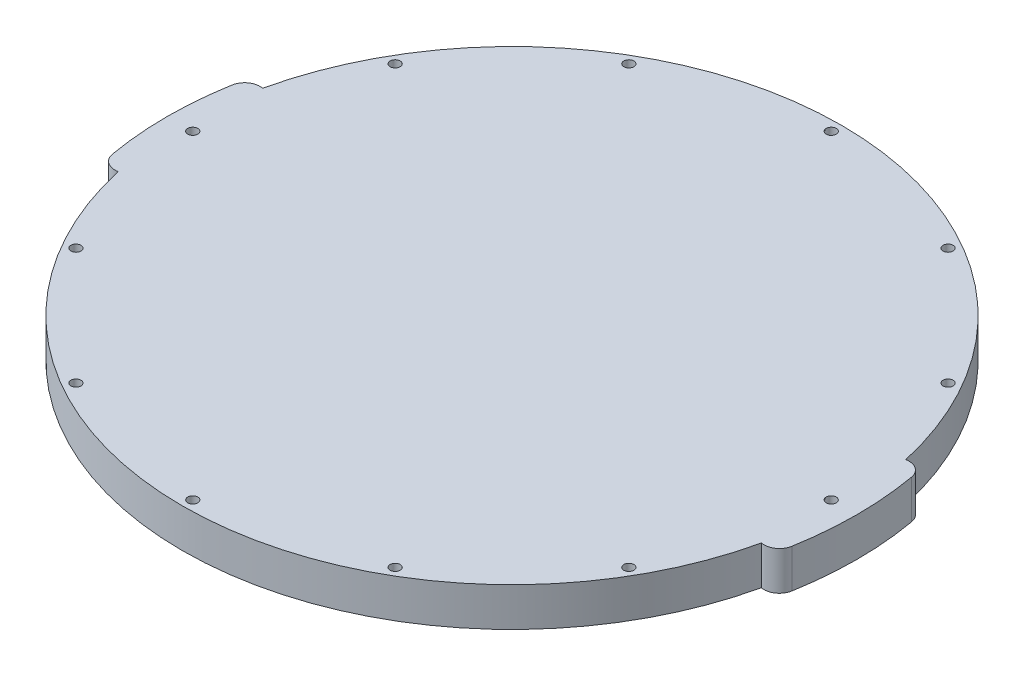
ISO-10303-21;
HEADER;
FILE_DESCRIPTION(('STEP AP214'),'2;1');
FILE_NAME('part.step','',(''),(''),'','','');
FILE_SCHEMA(('AUTOMOTIVE_DESIGN { 1 0 10303 214 1 1 1 1 }'));
ENDSEC;
DATA;
#1=APPLICATION_CONTEXT('core data for automotive mechanical design processes');
#2=APPLICATION_PROTOCOL_DEFINITION('international standard','automotive_design',2000,#1);
#3=PRODUCT_CONTEXT('',#1,'mechanical');
#4=PRODUCT('Part','Part','',(#3));
#5=PRODUCT_RELATED_PRODUCT_CATEGORY('part','',(#4));
#6=PRODUCT_DEFINITION_FORMATION('','',#4);
#7=PRODUCT_DEFINITION_CONTEXT('part definition',#1,'design');
#8=PRODUCT_DEFINITION('design','',#6,#7);
#9=PRODUCT_DEFINITION_SHAPE('','',#8);
#10=(LENGTH_UNIT() NAMED_UNIT(*) SI_UNIT(.MILLI.,.METRE.));
#11=(NAMED_UNIT(*) PLANE_ANGLE_UNIT() SI_UNIT($,.RADIAN.));
#12=(NAMED_UNIT(*) SI_UNIT($,.STERADIAN.) SOLID_ANGLE_UNIT());
#13=UNCERTAINTY_MEASURE_WITH_UNIT(LENGTH_MEASURE(1.E-05),#10,'distance_accuracy_value','');
#14=(GEOMETRIC_REPRESENTATION_CONTEXT(3) GLOBAL_UNCERTAINTY_ASSIGNED_CONTEXT((#13)) GLOBAL_UNIT_ASSIGNED_CONTEXT((#10,
#11,#12)) REPRESENTATION_CONTEXT('',''));
#15=CARTESIAN_POINT('',(0.,0.,0.));
#16=DIRECTION('',(0.,0.,1.));
#17=DIRECTION('',(1.,0.,0.));
#18=AXIS2_PLACEMENT_3D('',#15,#16,#17);
#19=CARTESIAN_POINT('',(-53.1549984688337,12.7,-9.37266038957257));
#20=DIRECTION('',(0.,-1.,0.));
#21=DIRECTION('',(0.,0.,-1.));
#22=AXIS2_PLACEMENT_3D('',#19,#20,#21);
#23=PLANE('',#22);
#24=CARTESIAN_POINT('',(-90.5429559656631,12.7,-52.2749999999999));
#25=DIRECTION('',(0.,1.,0.));
#26=DIRECTION('',(0.,0.,1.));
#27=AXIS2_PLACEMENT_3D('',#24,#25,#26);
#28=CIRCLE('',#27,1.65000000000126);
#29=CARTESIAN_POINT('',(-90.5429559656631,12.7,-50.6249999999987));
#30=VERTEX_POINT('',#29);
#31=EDGE_CURVE('E242',#30,#30,#28,.T.);
#32=ORIENTED_EDGE('',*,*,#31,.F.);
#33=EDGE_LOOP('',(#32));
#34=FACE_BOUND('',#33,.T.);
#35=CARTESIAN_POINT('',(-90.542955965663,12.7,52.2750000000001));
#36=DIRECTION('',(0.,1.,0.));
#37=DIRECTION('',(0.,0.,1.));
#38=AXIS2_PLACEMENT_3D('',#35,#36,#37);
#39=CIRCLE('',#38,1.65000000000101);
#40=CARTESIAN_POINT('',(-90.542955965663,12.7,53.9250000000011));
#41=VERTEX_POINT('',#40);
#42=EDGE_CURVE('E230',#41,#41,#39,.T.);
#43=ORIENTED_EDGE('',*,*,#42,.F.);
#44=EDGE_LOOP('',(#43));
#45=FACE_BOUND('',#44,.T.);
#46=CARTESIAN_POINT('',(0.,12.7,104.55));
#47=DIRECTION('',(0.,1.,0.));
#48=DIRECTION('',(0.,0.,1.));
#49=AXIS2_PLACEMENT_3D('',#46,#47,#48);
#50=CIRCLE('',#49,1.65000000000074);
#51=CARTESIAN_POINT('',(0.,12.7,106.200000000001));
#52=VERTEX_POINT('',#51);
#53=EDGE_CURVE('E218',#52,#52,#50,.T.);
#54=ORIENTED_EDGE('',*,*,#53,.F.);
#55=EDGE_LOOP('',(#54));
#56=FACE_BOUND('',#55,.T.);
#57=CARTESIAN_POINT('',(90.5429559656631,12.7,52.275));
#58=DIRECTION('',(0.,1.,0.));
#59=DIRECTION('',(0.,0.,1.));
#60=AXIS2_PLACEMENT_3D('',#57,#58,#59);
#61=CIRCLE('',#60,1.65000000000052);
#62=CARTESIAN_POINT('',(90.5429559656631,12.7,53.9250000000005));
#63=VERTEX_POINT('',#62);
#64=EDGE_CURVE('E206',#63,#63,#61,.T.);
#65=ORIENTED_EDGE('',*,*,#64,.F.);
#66=EDGE_LOOP('',(#65));
#67=FACE_BOUND('',#66,.T.);
#68=CARTESIAN_POINT('',(90.5429559656631,12.7,-52.275));
#69=DIRECTION('',(0.,1.,0.));
#70=DIRECTION('',(0.,0.,1.));
#71=AXIS2_PLACEMENT_3D('',#68,#69,#70);
#72=CIRCLE('',#71,1.65000000000024);
#73=CARTESIAN_POINT('',(90.5429559656631,12.7,-50.6249999999998));
#74=VERTEX_POINT('',#73);
#75=EDGE_CURVE('E194',#74,#74,#72,.T.);
#76=ORIENTED_EDGE('',*,*,#75,.F.);
#77=EDGE_LOOP('',(#76));
#78=FACE_BOUND('',#77,.T.);
#79=CARTESIAN_POINT('',(0.,12.7,-104.55));
#80=DIRECTION('',(0.,1.,0.));
#81=DIRECTION('',(0.,0.,1.));
#82=AXIS2_PLACEMENT_3D('',#79,#80,#81);
#83=CIRCLE('',#82,1.65);
#84=CARTESIAN_POINT('',(0.,12.7,-102.9));
#85=VERTEX_POINT('',#84);
#86=EDGE_CURVE('E140',#85,#85,#83,.T.);
#87=ORIENTED_EDGE('',*,*,#86,.F.);
#88=EDGE_LOOP('',(#87));
#89=FACE_BOUND('',#88,.T.);
#90=CARTESIAN_POINT('',(-106.309996937667,12.7,-18.7453207791451));
#91=DIRECTION('',(0.,1.,0.));
#92=DIRECTION('',(0.,0.,-1.));
#93=AXIS2_PLACEMENT_3D('',#90,#91,#92);
#94=CIRCLE('',#93,5.00000000000021);
#95=CARTESIAN_POINT('',(-105.327953740908,12.7,-23.6479314265143));
#96=VERTEX_POINT('',#95);
#97=CARTESIAN_POINT('',(-111.234035702729,12.7,-19.6135616674797));
#98=VERTEX_POINT('',#97);
#99=EDGE_CURVE('E151',#96,#98,#94,.T.);
#100=ORIENTED_EDGE('',*,*,#99,.T.);
#101=CARTESIAN_POINT('',(0.,12.7,0.));
#102=DIRECTION('',(0.,1.,0.));
#103=DIRECTION('',(0.,0.,-1.));
#104=AXIS2_PLACEMENT_3D('',#101,#102,#103);
#105=CIRCLE('',#104,112.95);
#106=CARTESIAN_POINT('',(-111.234035702729,12.7,19.6135616674798));
#107=VERTEX_POINT('',#106);
#108=EDGE_CURVE('E99',#98,#107,#105,.T.);
#109=ORIENTED_EDGE('',*,*,#108,.T.);
#110=CARTESIAN_POINT('',(-106.309996937668,12.7,18.7453207791452));
#111=DIRECTION('',(0.,1.,0.));
#112=DIRECTION('',(0.,0.,1.));
#113=AXIS2_PLACEMENT_3D('',#110,#111,#112);
#114=CIRCLE('',#113,5.00000000000001);
#115=CARTESIAN_POINT('',(-105.327953740908,12.7,23.6479314265144));
#116=VERTEX_POINT('',#115);
#117=EDGE_CURVE('E166',#107,#116,#114,.T.);
#118=ORIENTED_EDGE('',*,*,#117,.T.);
#119=CARTESIAN_POINT('',(0.,12.7,-4.92661467177413E-13));
#120=DIRECTION('',(0.,1.,0.));
#121=DIRECTION('',(0.,0.,-1.));
#122=AXIS2_PLACEMENT_3D('',#119,#120,#121);
#123=CIRCLE('',#122,107.95);
#124=CARTESIAN_POINT('',(105.327953740908,12.7,23.6479314265145));
#125=VERTEX_POINT('',#124);
#126=EDGE_CURVE('E179',#116,#125,#123,.T.);
#127=ORIENTED_EDGE('',*,*,#126,.T.);
#128=CARTESIAN_POINT('',(106.309996937668,12.7,18.7453207791452));
#129=DIRECTION('',(0.,1.,0.));
#130=DIRECTION('',(0.,0.,-1.));
#131=AXIS2_PLACEMENT_3D('',#128,#129,#130);
#132=CIRCLE('',#131,5.00000000000002);
#133=CARTESIAN_POINT('',(111.234035702729,12.7,19.6135616674798));
#134=VERTEX_POINT('',#133);
#135=EDGE_CURVE('E118',#125,#134,#132,.T.);
#136=ORIENTED_EDGE('',*,*,#135,.T.);
#137=CARTESIAN_POINT('',(-1.29063426612674E-12,12.7,0.));
#138=DIRECTION('',(0.,1.,0.));
#139=DIRECTION('',(0.,0.,1.));
#140=AXIS2_PLACEMENT_3D('',#137,#138,#139);
#141=CIRCLE('',#140,112.950000000001);
#142=CARTESIAN_POINT('',(111.234035702729,12.7,-19.6135616674798));
#143=VERTEX_POINT('',#142);
#144=EDGE_CURVE('E112',#134,#143,#141,.T.);
#145=ORIENTED_EDGE('',*,*,#144,.T.);
#146=CARTESIAN_POINT('',(106.309996937668,12.7,-18.7453207791452));
#147=DIRECTION('',(0.,1.,0.));
#148=DIRECTION('',(0.,0.,1.));
#149=AXIS2_PLACEMENT_3D('',#146,#147,#148);
#150=CIRCLE('',#149,5.);
#151=CARTESIAN_POINT('',(105.327953740908,12.7,-23.6479314265144));
#152=VERTEX_POINT('',#151);
#153=EDGE_CURVE('E116',#143,#152,#150,.T.);
#154=ORIENTED_EDGE('',*,*,#153,.T.);
#155=CARTESIAN_POINT('',(0.,12.7,0.));
#156=DIRECTION('',(0.,1.,0.));
#157=DIRECTION('',(0.,0.,-1.));
#158=AXIS2_PLACEMENT_3D('',#155,#156,#157);
#159=CIRCLE('',#158,107.95);
#160=EDGE_CURVE('E56',#152,#96,#159,.T.);
#161=ORIENTED_EDGE('',*,*,#160,.T.);
#162=EDGE_LOOP('',(#100,#109,#118,#127,#136,#145,#154,#161));
#163=FACE_BOUND('',#162,.T.);
#164=CARTESIAN_POINT('',(52.275,12.7,-90.5429559656631));
#165=DIRECTION('',(0.,1.,0.));
#166=DIRECTION('',(0.,0.,1.));
#167=AXIS2_PLACEMENT_3D('',#164,#165,#166);
#168=CIRCLE('',#167,1.65000000000009);
#169=CARTESIAN_POINT('',(52.275,12.7,-88.892955965663));
#170=VERTEX_POINT('',#169);
#171=EDGE_CURVE('E188',#170,#170,#168,.T.);
#172=ORIENTED_EDGE('',*,*,#171,.F.);
#173=EDGE_LOOP('',(#172));
#174=FACE_BOUND('',#173,.T.);
#175=CARTESIAN_POINT('',(104.55,12.7,0.));
#176=DIRECTION('',(0.,1.,0.));
#177=DIRECTION('',(0.,0.,1.));
#178=AXIS2_PLACEMENT_3D('',#175,#176,#177);
#179=CIRCLE('',#178,1.65000000000037);
#180=CARTESIAN_POINT('',(104.55,12.7,1.65000000000035));
#181=VERTEX_POINT('',#180);
#182=EDGE_CURVE('E200',#181,#181,#179,.T.);
#183=ORIENTED_EDGE('',*,*,#182,.F.);
#184=EDGE_LOOP('',(#183));
#185=FACE_BOUND('',#184,.T.);
#186=CARTESIAN_POINT('',(52.2750000000001,12.7,90.542955965663));
#187=DIRECTION('',(0.,1.,0.));
#188=DIRECTION('',(0.,0.,1.));
#189=AXIS2_PLACEMENT_3D('',#186,#187,#188);
#190=CIRCLE('',#189,1.65000000000066);
#191=CARTESIAN_POINT('',(52.2750000000001,12.7,92.1929559656637));
#192=VERTEX_POINT('',#191);
#193=EDGE_CURVE('E212',#192,#192,#190,.T.);
#194=ORIENTED_EDGE('',*,*,#193,.F.);
#195=EDGE_LOOP('',(#194));
#196=FACE_BOUND('',#195,.T.);
#197=CARTESIAN_POINT('',(-52.2749999999999,12.7,90.5429559656631));
#198=DIRECTION('',(0.,1.,0.));
#199=DIRECTION('',(0.,0.,1.));
#200=AXIS2_PLACEMENT_3D('',#197,#198,#199);
#201=CIRCLE('',#200,1.65000000000089);
#202=CARTESIAN_POINT('',(-52.2749999999999,12.7,92.192955965664));
#203=VERTEX_POINT('',#202);
#204=EDGE_CURVE('E224',#203,#203,#201,.T.);
#205=ORIENTED_EDGE('',*,*,#204,.F.);
#206=EDGE_LOOP('',(#205));
#207=FACE_BOUND('',#206,.T.);
#208=CARTESIAN_POINT('',(-104.55,12.7,0.));
#209=DIRECTION('',(0.,1.,0.));
#210=DIRECTION('',(0.,0.,1.));
#211=AXIS2_PLACEMENT_3D('',#208,#209,#210);
#212=CIRCLE('',#211,1.65000000000109);
#213=CARTESIAN_POINT('',(-104.55,12.7,1.65000000000112));
#214=VERTEX_POINT('',#213);
#215=EDGE_CURVE('E236',#214,#214,#212,.T.);
#216=ORIENTED_EDGE('',*,*,#215,.F.);
#217=EDGE_LOOP('',(#216));
#218=FACE_BOUND('',#217,.T.);
#219=CARTESIAN_POINT('',(-52.275,12.7,-90.542955965663));
#220=DIRECTION('',(0.,1.,0.));
#221=DIRECTION('',(0.,0.,1.));
#222=AXIS2_PLACEMENT_3D('',#219,#220,#221);
#223=CIRCLE('',#222,1.65000000000134);
#224=CARTESIAN_POINT('',(-52.275,12.7,-88.8929559656617));
#225=VERTEX_POINT('',#224);
#226=EDGE_CURVE('E248',#225,#225,#223,.T.);
#227=ORIENTED_EDGE('',*,*,#226,.F.);
#228=EDGE_LOOP('',(#227));
#229=FACE_BOUND('',#228,.T.);
#230=ADVANCED_FACE('F39',(#34,#45,#56,#67,#78,#89,#163,#174,#185,#196,#207,#218,#229),#23,.F.);
#231=CARTESIAN_POINT('',(-53.1549984688337,0.,-9.37266038957257));
#232=DIRECTION('',(0.,-1.,0.));
#233=DIRECTION('',(0.,0.,-1.));
#234=AXIS2_PLACEMENT_3D('',#231,#232,#233);
#235=PLANE('',#234);
#236=CARTESIAN_POINT('',(-90.5429559656631,0.,-52.2749999999999));
#237=DIRECTION('',(0.,1.,0.));
#238=DIRECTION('',(0.,0.,1.));
#239=AXIS2_PLACEMENT_3D('',#236,#237,#238);
#240=CIRCLE('',#239,1.65000000000126);
#241=CARTESIAN_POINT('',(-90.5429559656631,0.,-50.6249999999987));
#242=VERTEX_POINT('',#241);
#243=EDGE_CURVE('E245',#242,#242,#240,.T.);
#244=ORIENTED_EDGE('',*,*,#243,.T.);
#245=EDGE_LOOP('',(#244));
#246=FACE_BOUND('',#245,.T.);
#247=CARTESIAN_POINT('',(-90.542955965663,0.,52.2750000000001));
#248=DIRECTION('',(0.,1.,0.));
#249=DIRECTION('',(0.,0.,1.));
#250=AXIS2_PLACEMENT_3D('',#247,#248,#249);
#251=CIRCLE('',#250,1.65000000000101);
#252=CARTESIAN_POINT('',(-90.542955965663,0.,53.9250000000011));
#253=VERTEX_POINT('',#252);
#254=EDGE_CURVE('E233',#253,#253,#251,.T.);
#255=ORIENTED_EDGE('',*,*,#254,.T.);
#256=EDGE_LOOP('',(#255));
#257=FACE_BOUND('',#256,.T.);
#258=CARTESIAN_POINT('',(0.,0.,104.55));
#259=DIRECTION('',(0.,1.,0.));
#260=DIRECTION('',(0.,0.,1.));
#261=AXIS2_PLACEMENT_3D('',#258,#259,#260);
#262=CIRCLE('',#261,1.65000000000074);
#263=CARTESIAN_POINT('',(0.,0.,106.200000000001));
#264=VERTEX_POINT('',#263);
#265=EDGE_CURVE('E221',#264,#264,#262,.T.);
#266=ORIENTED_EDGE('',*,*,#265,.T.);
#267=EDGE_LOOP('',(#266));
#268=FACE_BOUND('',#267,.T.);
#269=CARTESIAN_POINT('',(90.5429559656631,0.,52.275));
#270=DIRECTION('',(0.,1.,0.));
#271=DIRECTION('',(0.,0.,1.));
#272=AXIS2_PLACEMENT_3D('',#269,#270,#271);
#273=CIRCLE('',#272,1.65000000000052);
#274=CARTESIAN_POINT('',(90.5429559656631,0.,53.9250000000005));
#275=VERTEX_POINT('',#274);
#276=EDGE_CURVE('E209',#275,#275,#273,.T.);
#277=ORIENTED_EDGE('',*,*,#276,.T.);
#278=EDGE_LOOP('',(#277));
#279=FACE_BOUND('',#278,.T.);
#280=CARTESIAN_POINT('',(90.5429559656631,0.,-52.275));
#281=DIRECTION('',(0.,1.,0.));
#282=DIRECTION('',(0.,0.,1.));
#283=AXIS2_PLACEMENT_3D('',#280,#281,#282);
#284=CIRCLE('',#283,1.65000000000024);
#285=CARTESIAN_POINT('',(90.5429559656631,0.,-50.6249999999998));
#286=VERTEX_POINT('',#285);
#287=EDGE_CURVE('E197',#286,#286,#284,.T.);
#288=ORIENTED_EDGE('',*,*,#287,.T.);
#289=EDGE_LOOP('',(#288));
#290=FACE_BOUND('',#289,.T.);
#291=CARTESIAN_POINT('',(0.,0.,-104.55));
#292=DIRECTION('',(0.,1.,0.));
#293=DIRECTION('',(0.,0.,1.));
#294=AXIS2_PLACEMENT_3D('',#291,#292,#293);
#295=CIRCLE('',#294,1.65);
#296=CARTESIAN_POINT('',(0.,0.,-102.9));
#297=VERTEX_POINT('',#296);
#298=EDGE_CURVE('E185',#297,#297,#295,.T.);
#299=ORIENTED_EDGE('',*,*,#298,.T.);
#300=EDGE_LOOP('',(#299));
#301=FACE_BOUND('',#300,.T.);
#302=CARTESIAN_POINT('',(-106.309996937667,0.,-18.7453207791451));
#303=DIRECTION('',(0.,1.,0.));
#304=DIRECTION('',(0.,0.,-1.));
#305=AXIS2_PLACEMENT_3D('',#302,#303,#304);
#306=CIRCLE('',#305,5.00000000000021);
#307=CARTESIAN_POINT('',(-105.327953740908,0.,-23.6479314265143));
#308=VERTEX_POINT('',#307);
#309=CARTESIAN_POINT('',(-111.234035702729,0.,-19.6135616674797));
#310=VERTEX_POINT('',#309);
#311=EDGE_CURVE('E136',#308,#310,#306,.T.);
#312=ORIENTED_EDGE('',*,*,#311,.F.);
#313=CARTESIAN_POINT('',(0.,0.,0.));
#314=DIRECTION('',(0.,1.,0.));
#315=DIRECTION('',(0.,0.,-1.));
#316=AXIS2_PLACEMENT_3D('',#313,#314,#315);
#317=CIRCLE('',#316,107.95);
#318=CARTESIAN_POINT('',(105.327953740908,0.,-23.6479314265144));
#319=VERTEX_POINT('',#318);
#320=EDGE_CURVE('E91',#319,#308,#317,.T.);
#321=ORIENTED_EDGE('',*,*,#320,.F.);
#322=CARTESIAN_POINT('',(106.309996937668,0.,-18.7453207791452));
#323=DIRECTION('',(0.,1.,0.));
#324=DIRECTION('',(0.,0.,1.));
#325=AXIS2_PLACEMENT_3D('',#322,#323,#324);
#326=CIRCLE('',#325,5.);
#327=CARTESIAN_POINT('',(111.234035702729,0.,-19.6135616674798));
#328=VERTEX_POINT('',#327);
#329=EDGE_CURVE('E85',#328,#319,#326,.T.);
#330=ORIENTED_EDGE('',*,*,#329,.F.);
#331=CARTESIAN_POINT('',(-1.29063426612674E-12,0.,0.));
#332=DIRECTION('',(0.,1.,0.));
#333=DIRECTION('',(0.,0.,1.));
#334=AXIS2_PLACEMENT_3D('',#331,#332,#333);
#335=CIRCLE('',#334,112.950000000001);
#336=CARTESIAN_POINT('',(111.234035702729,0.,19.6135616674798));
#337=VERTEX_POINT('',#336);
#338=EDGE_CURVE('E126',#337,#328,#335,.T.);
#339=ORIENTED_EDGE('',*,*,#338,.F.);
#340=CARTESIAN_POINT('',(106.309996937668,0.,18.7453207791452));
#341=DIRECTION('',(0.,1.,0.));
#342=DIRECTION('',(0.,0.,-1.));
#343=AXIS2_PLACEMENT_3D('',#340,#341,#342);
#344=CIRCLE('',#343,5.00000000000002);
#345=CARTESIAN_POINT('',(105.327953740908,0.,23.6479314265145));
#346=VERTEX_POINT('',#345);
#347=EDGE_CURVE('E146',#346,#337,#344,.T.);
#348=ORIENTED_EDGE('',*,*,#347,.F.);
#349=CARTESIAN_POINT('',(0.,0.,-4.92661467177413E-13));
#350=DIRECTION('',(0.,1.,0.));
#351=DIRECTION('',(0.,0.,-1.));
#352=AXIS2_PLACEMENT_3D('',#349,#350,#351);
#353=CIRCLE('',#352,107.95);
#354=CARTESIAN_POINT('',(-105.327953740908,0.,23.6479314265144));
#355=VERTEX_POINT('',#354);
#356=EDGE_CURVE('E144',#355,#346,#353,.T.);
#357=ORIENTED_EDGE('',*,*,#356,.F.);
#358=CARTESIAN_POINT('',(-106.309996937668,0.,18.7453207791452));
#359=DIRECTION('',(0.,1.,0.));
#360=DIRECTION('',(0.,0.,1.));
#361=AXIS2_PLACEMENT_3D('',#358,#359,#360);
#362=CIRCLE('',#361,5.00000000000001);
#363=CARTESIAN_POINT('',(-111.234035702729,0.,19.6135616674798));
#364=VERTEX_POINT('',#363);
#365=EDGE_CURVE('E142',#364,#355,#362,.T.);
#366=ORIENTED_EDGE('',*,*,#365,.F.);
#367=CARTESIAN_POINT('',(0.,0.,0.));
#368=DIRECTION('',(0.,1.,0.));
#369=DIRECTION('',(0.,0.,-1.));
#370=AXIS2_PLACEMENT_3D('',#367,#368,#369);
#371=CIRCLE('',#370,112.95);
#372=EDGE_CURVE('E139',#310,#364,#371,.T.);
#373=ORIENTED_EDGE('',*,*,#372,.F.);
#374=EDGE_LOOP('',(#312,#321,#330,#339,#348,#357,#366,#373));
#375=FACE_BOUND('',#374,.T.);
#376=CARTESIAN_POINT('',(52.275,0.,-90.5429559656631));
#377=DIRECTION('',(0.,1.,0.));
#378=DIRECTION('',(0.,0.,1.));
#379=AXIS2_PLACEMENT_3D('',#376,#377,#378);
#380=CIRCLE('',#379,1.65000000000009);
#381=CARTESIAN_POINT('',(52.275,0.,-88.892955965663));
#382=VERTEX_POINT('',#381);
#383=EDGE_CURVE('E191',#382,#382,#380,.T.);
#384=ORIENTED_EDGE('',*,*,#383,.T.);
#385=EDGE_LOOP('',(#384));
#386=FACE_BOUND('',#385,.T.);
#387=CARTESIAN_POINT('',(104.55,0.,0.));
#388=DIRECTION('',(0.,1.,0.));
#389=DIRECTION('',(0.,0.,1.));
#390=AXIS2_PLACEMENT_3D('',#387,#388,#389);
#391=CIRCLE('',#390,1.65000000000037);
#392=CARTESIAN_POINT('',(104.55,0.,1.65000000000035));
#393=VERTEX_POINT('',#392);
#394=EDGE_CURVE('E203',#393,#393,#391,.T.);
#395=ORIENTED_EDGE('',*,*,#394,.T.);
#396=EDGE_LOOP('',(#395));
#397=FACE_BOUND('',#396,.T.);
#398=CARTESIAN_POINT('',(52.2750000000001,0.,90.542955965663));
#399=DIRECTION('',(0.,1.,0.));
#400=DIRECTION('',(0.,0.,1.));
#401=AXIS2_PLACEMENT_3D('',#398,#399,#400);
#402=CIRCLE('',#401,1.65000000000066);
#403=CARTESIAN_POINT('',(52.2750000000001,0.,92.1929559656637));
#404=VERTEX_POINT('',#403);
#405=EDGE_CURVE('E215',#404,#404,#402,.T.);
#406=ORIENTED_EDGE('',*,*,#405,.T.);
#407=EDGE_LOOP('',(#406));
#408=FACE_BOUND('',#407,.T.);
#409=CARTESIAN_POINT('',(-52.2749999999999,0.,90.5429559656631));
#410=DIRECTION('',(0.,1.,0.));
#411=DIRECTION('',(0.,0.,1.));
#412=AXIS2_PLACEMENT_3D('',#409,#410,#411);
#413=CIRCLE('',#412,1.65000000000089);
#414=CARTESIAN_POINT('',(-52.2749999999999,0.,92.192955965664));
#415=VERTEX_POINT('',#414);
#416=EDGE_CURVE('E227',#415,#415,#413,.T.);
#417=ORIENTED_EDGE('',*,*,#416,.T.);
#418=EDGE_LOOP('',(#417));
#419=FACE_BOUND('',#418,.T.);
#420=CARTESIAN_POINT('',(-104.55,0.,0.));
#421=DIRECTION('',(0.,1.,0.));
#422=DIRECTION('',(0.,0.,1.));
#423=AXIS2_PLACEMENT_3D('',#420,#421,#422);
#424=CIRCLE('',#423,1.65000000000109);
#425=CARTESIAN_POINT('',(-104.55,0.,1.65000000000112));
#426=VERTEX_POINT('',#425);
#427=EDGE_CURVE('E239',#426,#426,#424,.T.);
#428=ORIENTED_EDGE('',*,*,#427,.T.);
#429=EDGE_LOOP('',(#428));
#430=FACE_BOUND('',#429,.T.);
#431=CARTESIAN_POINT('',(-52.275,0.,-90.542955965663));
#432=DIRECTION('',(0.,1.,0.));
#433=DIRECTION('',(0.,0.,1.));
#434=AXIS2_PLACEMENT_3D('',#431,#432,#433);
#435=CIRCLE('',#434,1.65000000000134);
#436=CARTESIAN_POINT('',(-52.275,0.,-88.8929559656617));
#437=VERTEX_POINT('',#436);
#438=EDGE_CURVE('E251',#437,#437,#435,.T.);
#439=ORIENTED_EDGE('',*,*,#438,.T.);
#440=EDGE_LOOP('',(#439));
#441=FACE_BOUND('',#440,.T.);
#442=ADVANCED_FACE('F170',(#246,#257,#268,#279,#290,#301,#375,#386,#397,#408,#419,#430,#441),
#235,.T.);
#443=CARTESIAN_POINT('',(-106.309996937667,12.7,-18.7453207791451));
#444=DIRECTION('',(0.,-1.,0.));
#445=DIRECTION('',(0.,0.,-1.));
#446=AXIS2_PLACEMENT_3D('',#443,#444,#445);
#447=CYLINDRICAL_SURFACE('',#446,5.00000000000021);
#448=ORIENTED_EDGE('',*,*,#311,.T.);
#449=DIRECTION('',(0.,-1.,0.));
#450=VECTOR('',#449,1.);
#451=CARTESIAN_POINT('',(-111.234035702729,12.7,-19.6135616674797));
#452=LINE('',#451,#450);
#453=EDGE_CURVE('E11',#98,#310,#452,.T.);
#454=ORIENTED_EDGE('',*,*,#453,.F.);
#455=ORIENTED_EDGE('',*,*,#99,.F.);
#456=DIRECTION('',(0.,-1.,0.));
#457=VECTOR('',#456,1.);
#458=CARTESIAN_POINT('',(-105.327953740908,12.7,-23.6479314265143));
#459=LINE('',#458,#457);
#460=EDGE_CURVE('E132',#96,#308,#459,.T.);
#461=ORIENTED_EDGE('',*,*,#460,.T.);
#462=EDGE_LOOP('',(#448,#454,#455,#461));
#463=FACE_BOUND('',#462,.T.);
#464=ADVANCED_FACE('F41',(#463),#447,.T.);
#465=CARTESIAN_POINT('',(0.,12.7,0.));
#466=DIRECTION('',(0.,-1.,0.));
#467=DIRECTION('',(0.,0.,-1.));
#468=AXIS2_PLACEMENT_3D('',#465,#466,#467);
#469=CYLINDRICAL_SURFACE('',#468,112.95);
#470=ORIENTED_EDGE('',*,*,#372,.T.);
#471=DIRECTION('',(0.,-1.,0.));
#472=VECTOR('',#471,1.);
#473=CARTESIAN_POINT('',(-111.234035702729,12.7,19.6135616674798));
#474=LINE('',#473,#472);
#475=EDGE_CURVE('E48',#107,#364,#474,.T.);
#476=ORIENTED_EDGE('',*,*,#475,.F.);
#477=ORIENTED_EDGE('',*,*,#108,.F.);
#478=ORIENTED_EDGE('',*,*,#453,.T.);
#479=EDGE_LOOP('',(#470,#476,#477,#478));
#480=FACE_BOUND('',#479,.T.);
#481=ADVANCED_FACE('F286',(#480),#469,.T.);
#482=CARTESIAN_POINT('',(-106.309996937668,12.7,18.7453207791452));
#483=DIRECTION('',(0.,-1.,0.));
#484=DIRECTION('',(0.,0.,-1.));
#485=AXIS2_PLACEMENT_3D('',#482,#483,#484);
#486=CYLINDRICAL_SURFACE('',#485,5.00000000000001);
#487=ORIENTED_EDGE('',*,*,#365,.T.);
#488=DIRECTION('',(0.,-1.,0.));
#489=VECTOR('',#488,1.);
#490=CARTESIAN_POINT('',(-105.327953740908,12.7,23.6479314265144));
#491=LINE('',#490,#489);
#492=EDGE_CURVE('E158',#116,#355,#491,.T.);
#493=ORIENTED_EDGE('',*,*,#492,.F.);
#494=ORIENTED_EDGE('',*,*,#117,.F.);
#495=ORIENTED_EDGE('',*,*,#475,.T.);
#496=EDGE_LOOP('',(#487,#493,#494,#495));
#497=FACE_BOUND('',#496,.T.);
#498=ADVANCED_FACE('F164',(#497),#486,.T.);
#499=CARTESIAN_POINT('',(0.,12.7,-4.92661467177413E-13));
#500=DIRECTION('',(0.,-1.,0.));
#501=DIRECTION('',(0.,0.,-1.));
#502=AXIS2_PLACEMENT_3D('',#499,#500,#501);
#503=CYLINDRICAL_SURFACE('',#502,107.95);
#504=ORIENTED_EDGE('',*,*,#356,.T.);
#505=DIRECTION('',(0.,-1.,0.));
#506=VECTOR('',#505,1.);
#507=CARTESIAN_POINT('',(105.327953740908,12.7,23.6479314265145));
#508=LINE('',#507,#506);
#509=EDGE_CURVE('E155',#125,#346,#508,.T.);
#510=ORIENTED_EDGE('',*,*,#509,.F.);
#511=ORIENTED_EDGE('',*,*,#126,.F.);
#512=ORIENTED_EDGE('',*,*,#492,.T.);
#513=EDGE_LOOP('',(#504,#510,#511,#512));
#514=FACE_BOUND('',#513,.T.);
#515=ADVANCED_FACE('F175',(#514),#503,.T.);
#516=CARTESIAN_POINT('',(106.309996937668,12.7,18.7453207791452));
#517=DIRECTION('',(0.,-1.,0.));
#518=DIRECTION('',(0.,0.,-1.));
#519=AXIS2_PLACEMENT_3D('',#516,#517,#518);
#520=CYLINDRICAL_SURFACE('',#519,5.00000000000002);
#521=ORIENTED_EDGE('',*,*,#347,.T.);
#522=DIRECTION('',(0.,-1.,0.));
#523=VECTOR('',#522,1.);
#524=CARTESIAN_POINT('',(111.234035702729,12.7,19.6135616674798));
#525=LINE('',#524,#523);
#526=EDGE_CURVE('E127',#134,#337,#525,.T.);
#527=ORIENTED_EDGE('',*,*,#526,.F.);
#528=ORIENTED_EDGE('',*,*,#135,.F.);
#529=ORIENTED_EDGE('',*,*,#509,.T.);
#530=EDGE_LOOP('',(#521,#527,#528,#529));
#531=FACE_BOUND('',#530,.T.);
#532=ADVANCED_FACE('F178',(#531),#520,.T.);
#533=CARTESIAN_POINT('',(-1.29063426612674E-12,12.7,0.));
#534=DIRECTION('',(0.,-1.,0.));
#535=DIRECTION('',(0.,0.,-1.));
#536=AXIS2_PLACEMENT_3D('',#533,#534,#535);
#537=CYLINDRICAL_SURFACE('',#536,112.950000000001);
#538=ORIENTED_EDGE('',*,*,#338,.T.);
#539=DIRECTION('',(0.,-1.,0.));
#540=VECTOR('',#539,1.);
#541=CARTESIAN_POINT('',(111.234035702729,12.7,-19.6135616674798));
#542=LINE('',#541,#540);
#543=EDGE_CURVE('E123',#143,#328,#542,.T.);
#544=ORIENTED_EDGE('',*,*,#543,.F.);
#545=ORIENTED_EDGE('',*,*,#144,.F.);
#546=ORIENTED_EDGE('',*,*,#526,.T.);
#547=EDGE_LOOP('',(#538,#544,#545,#546));
#548=FACE_BOUND('',#547,.T.);
#549=ADVANCED_FACE('F124',(#548),#537,.T.);
#550=CARTESIAN_POINT('',(106.309996937668,12.7,-18.7453207791452));
#551=DIRECTION('',(0.,-1.,0.));
#552=DIRECTION('',(0.,0.,-1.));
#553=AXIS2_PLACEMENT_3D('',#550,#551,#552);
#554=CYLINDRICAL_SURFACE('',#553,5.);
#555=ORIENTED_EDGE('',*,*,#329,.T.);
#556=DIRECTION('',(0.,-1.,0.));
#557=VECTOR('',#556,1.);
#558=CARTESIAN_POINT('',(105.327953740908,12.7,-23.6479314265144));
#559=LINE('',#558,#557);
#560=EDGE_CURVE('E128',#152,#319,#559,.T.);
#561=ORIENTED_EDGE('',*,*,#560,.F.);
#562=ORIENTED_EDGE('',*,*,#153,.F.);
#563=ORIENTED_EDGE('',*,*,#543,.T.);
#564=EDGE_LOOP('',(#555,#561,#562,#563));
#565=FACE_BOUND('',#564,.T.);
#566=ADVANCED_FACE('F130',(#565),#554,.T.);
#567=CARTESIAN_POINT('',(0.,12.7,0.));
#568=DIRECTION('',(0.,-1.,0.));
#569=DIRECTION('',(0.,0.,-1.));
#570=AXIS2_PLACEMENT_3D('',#567,#568,#569);
#571=CYLINDRICAL_SURFACE('',#570,107.95);
#572=ORIENTED_EDGE('',*,*,#320,.T.);
#573=ORIENTED_EDGE('',*,*,#460,.F.);
#574=ORIENTED_EDGE('',*,*,#160,.F.);
#575=ORIENTED_EDGE('',*,*,#560,.T.);
#576=EDGE_LOOP('',(#572,#573,#574,#575));
#577=FACE_BOUND('',#576,.T.);
#578=ADVANCED_FACE('F274',(#577),#571,.T.);
#579=CARTESIAN_POINT('',(0.,12.7,-104.55));
#580=DIRECTION('',(0.,-1.,0.));
#581=DIRECTION('',(0.,0.,-1.));
#582=AXIS2_PLACEMENT_3D('',#579,#580,#581);
#583=CYLINDRICAL_SURFACE('',#582,1.65);
#584=ORIENTED_EDGE('',*,*,#86,.T.);
#585=EDGE_LOOP('',(#584));
#586=FACE_BOUND('',#585,.T.);
#587=ORIENTED_EDGE('',*,*,#298,.F.);
#588=EDGE_LOOP('',(#587));
#589=FACE_BOUND('',#588,.T.);
#590=ADVANCED_FACE('F271',(#586,#589),#583,.F.);
#591=CARTESIAN_POINT('',(52.275,12.7,-90.5429559656631));
#592=DIRECTION('',(0.,-1.,0.));
#593=DIRECTION('',(0.,0.,-1.));
#594=AXIS2_PLACEMENT_3D('',#591,#592,#593);
#595=CYLINDRICAL_SURFACE('',#594,1.65000000000009);
#596=ORIENTED_EDGE('',*,*,#171,.T.);
#597=EDGE_LOOP('',(#596));
#598=FACE_BOUND('',#597,.T.);
#599=ORIENTED_EDGE('',*,*,#383,.F.);
#600=EDGE_LOOP('',(#599));
#601=FACE_BOUND('',#600,.T.);
#602=ADVANCED_FACE('F360',(#598,#601),#595,.F.);
#603=CARTESIAN_POINT('',(90.5429559656631,12.7,-52.275));
#604=DIRECTION('',(0.,-1.,0.));
#605=DIRECTION('',(0.,0.,-1.));
#606=AXIS2_PLACEMENT_3D('',#603,#604,#605);
#607=CYLINDRICAL_SURFACE('',#606,1.65000000000024);
#608=ORIENTED_EDGE('',*,*,#75,.T.);
#609=EDGE_LOOP('',(#608));
#610=FACE_BOUND('',#609,.T.);
#611=ORIENTED_EDGE('',*,*,#287,.F.);
#612=EDGE_LOOP('',(#611));
#613=FACE_BOUND('',#612,.T.);
#614=ADVANCED_FACE('F369',(#610,#613),#607,.F.);
#615=CARTESIAN_POINT('',(104.55,12.7,0.));
#616=DIRECTION('',(0.,-1.,0.));
#617=DIRECTION('',(0.,0.,-1.));
#618=AXIS2_PLACEMENT_3D('',#615,#616,#617);
#619=CYLINDRICAL_SURFACE('',#618,1.65000000000037);
#620=ORIENTED_EDGE('',*,*,#182,.T.);
#621=EDGE_LOOP('',(#620));
#622=FACE_BOUND('',#621,.T.);
#623=ORIENTED_EDGE('',*,*,#394,.F.);
#624=EDGE_LOOP('',(#623));
#625=FACE_BOUND('',#624,.T.);
#626=ADVANCED_FACE('F378',(#622,#625),#619,.F.);
#627=CARTESIAN_POINT('',(90.5429559656631,12.7,52.275));
#628=DIRECTION('',(0.,-1.,0.));
#629=DIRECTION('',(0.,0.,-1.));
#630=AXIS2_PLACEMENT_3D('',#627,#628,#629);
#631=CYLINDRICAL_SURFACE('',#630,1.65000000000052);
#632=ORIENTED_EDGE('',*,*,#64,.T.);
#633=EDGE_LOOP('',(#632));
#634=FACE_BOUND('',#633,.T.);
#635=ORIENTED_EDGE('',*,*,#276,.F.);
#636=EDGE_LOOP('',(#635));
#637=FACE_BOUND('',#636,.T.);
#638=ADVANCED_FACE('F388',(#634,#637),#631,.F.);
#639=CARTESIAN_POINT('',(52.2750000000001,12.7,90.542955965663));
#640=DIRECTION('',(0.,-1.,0.));
#641=DIRECTION('',(0.,0.,-1.));
#642=AXIS2_PLACEMENT_3D('',#639,#640,#641);
#643=CYLINDRICAL_SURFACE('',#642,1.65000000000066);
#644=ORIENTED_EDGE('',*,*,#193,.T.);
#645=EDGE_LOOP('',(#644));
#646=FACE_BOUND('',#645,.T.);
#647=ORIENTED_EDGE('',*,*,#405,.F.);
#648=EDGE_LOOP('',(#647));
#649=FACE_BOUND('',#648,.T.);
#650=ADVANCED_FACE('F398',(#646,#649),#643,.F.);
#651=CARTESIAN_POINT('',(0.,12.7,104.55));
#652=DIRECTION('',(0.,-1.,0.));
#653=DIRECTION('',(0.,0.,-1.));
#654=AXIS2_PLACEMENT_3D('',#651,#652,#653);
#655=CYLINDRICAL_SURFACE('',#654,1.65000000000074);
#656=ORIENTED_EDGE('',*,*,#53,.T.);
#657=EDGE_LOOP('',(#656));
#658=FACE_BOUND('',#657,.T.);
#659=ORIENTED_EDGE('',*,*,#265,.F.);
#660=EDGE_LOOP('',(#659));
#661=FACE_BOUND('',#660,.T.);
#662=ADVANCED_FACE('F408',(#658,#661),#655,.F.);
#663=CARTESIAN_POINT('',(-52.2749999999999,12.7,90.5429559656631));
#664=DIRECTION('',(0.,-1.,0.));
#665=DIRECTION('',(0.,0.,-1.));
#666=AXIS2_PLACEMENT_3D('',#663,#664,#665);
#667=CYLINDRICAL_SURFACE('',#666,1.65000000000089);
#668=ORIENTED_EDGE('',*,*,#204,.T.);
#669=EDGE_LOOP('',(#668));
#670=FACE_BOUND('',#669,.T.);
#671=ORIENTED_EDGE('',*,*,#416,.F.);
#672=EDGE_LOOP('',(#671));
#673=FACE_BOUND('',#672,.T.);
#674=ADVANCED_FACE('F418',(#670,#673),#667,.F.);
#675=CARTESIAN_POINT('',(-90.542955965663,12.7,52.2750000000001));
#676=DIRECTION('',(0.,-1.,0.));
#677=DIRECTION('',(0.,0.,-1.));
#678=AXIS2_PLACEMENT_3D('',#675,#676,#677);
#679=CYLINDRICAL_SURFACE('',#678,1.65000000000101);
#680=ORIENTED_EDGE('',*,*,#42,.T.);
#681=EDGE_LOOP('',(#680));
#682=FACE_BOUND('',#681,.T.);
#683=ORIENTED_EDGE('',*,*,#254,.F.);
#684=EDGE_LOOP('',(#683));
#685=FACE_BOUND('',#684,.T.);
#686=ADVANCED_FACE('F428',(#682,#685),#679,.F.);
#687=CARTESIAN_POINT('',(-104.55,12.7,0.));
#688=DIRECTION('',(0.,-1.,0.));
#689=DIRECTION('',(0.,0.,-1.));
#690=AXIS2_PLACEMENT_3D('',#687,#688,#689);
#691=CYLINDRICAL_SURFACE('',#690,1.65000000000109);
#692=ORIENTED_EDGE('',*,*,#215,.T.);
#693=EDGE_LOOP('',(#692));
#694=FACE_BOUND('',#693,.T.);
#695=ORIENTED_EDGE('',*,*,#427,.F.);
#696=EDGE_LOOP('',(#695));
#697=FACE_BOUND('',#696,.T.);
#698=ADVANCED_FACE('F438',(#694,#697),#691,.F.);
#699=CARTESIAN_POINT('',(-90.5429559656631,12.7,-52.2749999999999));
#700=DIRECTION('',(0.,-1.,0.));
#701=DIRECTION('',(0.,0.,-1.));
#702=AXIS2_PLACEMENT_3D('',#699,#700,#701);
#703=CYLINDRICAL_SURFACE('',#702,1.65000000000126);
#704=ORIENTED_EDGE('',*,*,#31,.T.);
#705=EDGE_LOOP('',(#704));
#706=FACE_BOUND('',#705,.T.);
#707=ORIENTED_EDGE('',*,*,#243,.F.);
#708=EDGE_LOOP('',(#707));
#709=FACE_BOUND('',#708,.T.);
#710=ADVANCED_FACE('F448',(#706,#709),#703,.F.);
#711=CARTESIAN_POINT('',(-52.275,12.7,-90.542955965663));
#712=DIRECTION('',(0.,-1.,0.));
#713=DIRECTION('',(0.,0.,-1.));
#714=AXIS2_PLACEMENT_3D('',#711,#712,#713);
#715=CYLINDRICAL_SURFACE('',#714,1.65000000000134);
#716=ORIENTED_EDGE('',*,*,#226,.T.);
#717=EDGE_LOOP('',(#716));
#718=FACE_BOUND('',#717,.T.);
#719=ORIENTED_EDGE('',*,*,#438,.F.);
#720=EDGE_LOOP('',(#719));
#721=FACE_BOUND('',#720,.T.);
#722=ADVANCED_FACE('F257',(#718,#721),#715,.F.);
#723=CLOSED_SHELL('',(#230,#442,#464,#481,#498,#515,#532,#549,#566,#578,#590,#602,#614,#626,
#638,#650,#662,#674,#686,#698,#710,#722));
#724=MANIFOLD_SOLID_BREP('B2',#723);
#725=ADVANCED_BREP_SHAPE_REPRESENTATION('',(#18,#724),#14);
#726=SHAPE_DEFINITION_REPRESENTATION(#9,#725);
ENDSEC;
END-ISO-10303-21;
